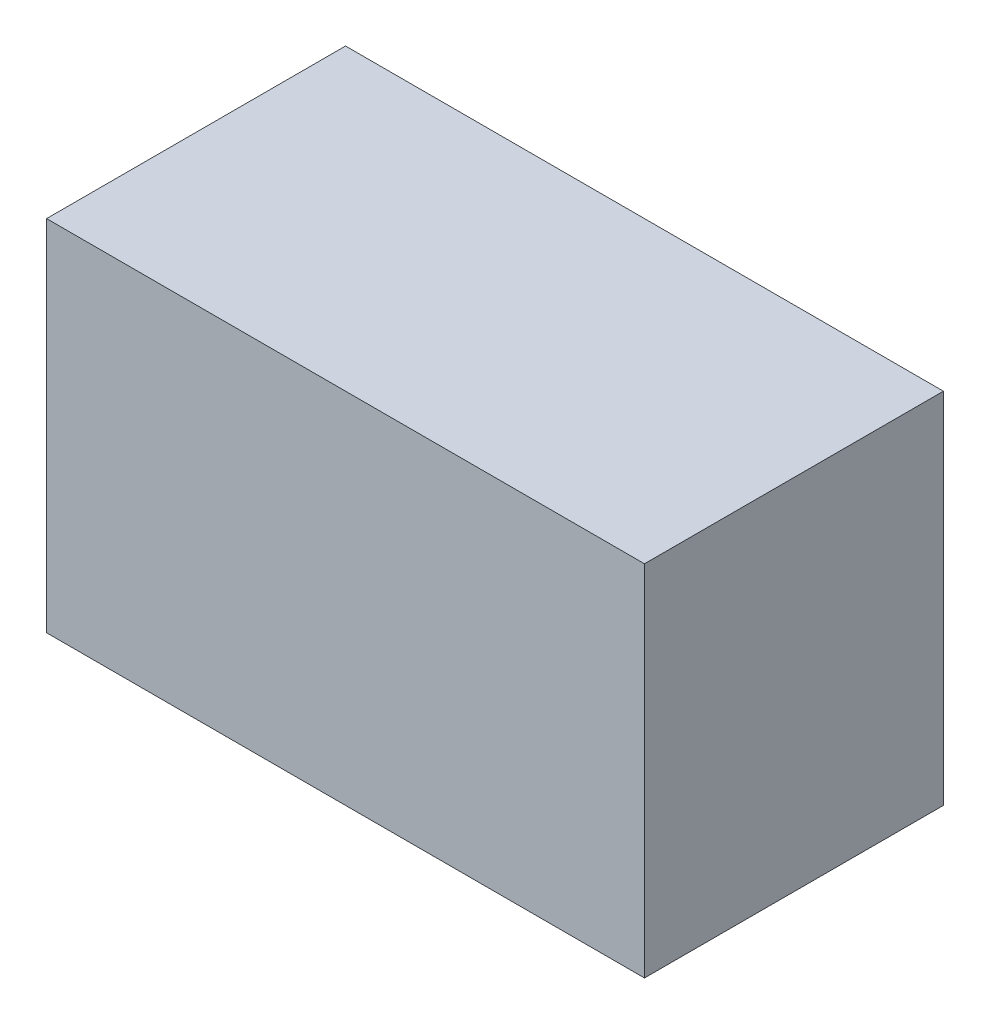
ISO-10303-21;
HEADER;
FILE_DESCRIPTION(('STEP AP214'),'2;1');
FILE_NAME('part.step','',(''),(''),'','','');
FILE_SCHEMA(('AUTOMOTIVE_DESIGN { 1 0 10303 214 1 1 1 1 }'));
ENDSEC;
DATA;
#1=APPLICATION_CONTEXT('core data for automotive mechanical design processes');
#2=APPLICATION_PROTOCOL_DEFINITION('international standard','automotive_design',2000,#1);
#3=PRODUCT_CONTEXT('',#1,'mechanical');
#4=PRODUCT('Part','Part','',(#3));
#5=PRODUCT_RELATED_PRODUCT_CATEGORY('part','',(#4));
#6=PRODUCT_DEFINITION_FORMATION('','',#4);
#7=PRODUCT_DEFINITION_CONTEXT('part definition',#1,'design');
#8=PRODUCT_DEFINITION('design','',#6,#7);
#9=PRODUCT_DEFINITION_SHAPE('','',#8);
#10=(LENGTH_UNIT() NAMED_UNIT(*) SI_UNIT(.MILLI.,.METRE.));
#11=(NAMED_UNIT(*) PLANE_ANGLE_UNIT() SI_UNIT($,.RADIAN.));
#12=(NAMED_UNIT(*) SI_UNIT($,.STERADIAN.) SOLID_ANGLE_UNIT());
#13=UNCERTAINTY_MEASURE_WITH_UNIT(LENGTH_MEASURE(1.E-05),#10,'distance_accuracy_value','');
#14=(GEOMETRIC_REPRESENTATION_CONTEXT(3) GLOBAL_UNCERTAINTY_ASSIGNED_CONTEXT((#13)) GLOBAL_UNIT_ASSIGNED_CONTEXT((#10,
#11,#12)) REPRESENTATION_CONTEXT('',''));
#15=CARTESIAN_POINT('',(0.,0.,0.));
#16=DIRECTION('',(0.,0.,1.));
#17=DIRECTION('',(1.,0.,0.));
#18=AXIS2_PLACEMENT_3D('',#15,#16,#17);
#19=CARTESIAN_POINT('',(0.,0.,127.5));
#20=DIRECTION('',(0.,-1.,0.));
#21=DIRECTION('',(0.,0.,-1.));
#22=AXIS2_PLACEMENT_3D('',#19,#20,#21);
#23=PLANE('',#22);
#24=DIRECTION('',(-1.,0.,0.));
#25=VECTOR('',#24,1.);
#26=CARTESIAN_POINT('',(25.,0.,115.));
#27=LINE('',#26,#25);
#28=CARTESIAN_POINT('',(25.,0.,115.));
#29=VERTEX_POINT('',#28);
#30=CARTESIAN_POINT('',(-25.,0.,115.));
#31=VERTEX_POINT('',#30);
#32=EDGE_CURVE('E27',#29,#31,#27,.T.);
#33=ORIENTED_EDGE('',*,*,#32,.T.);
#34=DIRECTION('',(0.,0.,1.));
#35=VECTOR('',#34,1.);
#36=CARTESIAN_POINT('',(-25.,0.,115.));
#37=LINE('',#36,#35);
#38=CARTESIAN_POINT('',(-25.,0.,140.));
#39=VERTEX_POINT('',#38);
#40=EDGE_CURVE('E100',#31,#39,#37,.T.);
#41=ORIENTED_EDGE('',*,*,#40,.T.);
#42=DIRECTION('',(1.,0.,0.));
#43=VECTOR('',#42,1.);
#44=CARTESIAN_POINT('',(-25.,0.,140.));
#45=LINE('',#44,#43);
#46=CARTESIAN_POINT('',(25.,0.,140.));
#47=VERTEX_POINT('',#46);
#48=EDGE_CURVE('E80',#39,#47,#45,.T.);
#49=ORIENTED_EDGE('',*,*,#48,.T.);
#50=DIRECTION('',(0.,0.,-1.));
#51=VECTOR('',#50,1.);
#52=CARTESIAN_POINT('',(25.,0.,140.));
#53=LINE('',#52,#51);
#54=EDGE_CURVE('E61',#47,#29,#53,.T.);
#55=ORIENTED_EDGE('',*,*,#54,.T.);
#56=EDGE_LOOP('',(#33,#41,#49,#55));
#57=FACE_BOUND('',#56,.T.);
#58=ADVANCED_FACE('F17',(#57),#23,.F.);
#59=CARTESIAN_POINT('',(0.,-30.,127.5));
#60=DIRECTION('',(0.,-1.,0.));
#61=DIRECTION('',(0.,0.,-1.));
#62=AXIS2_PLACEMENT_3D('',#59,#60,#61);
#63=PLANE('',#62);
#64=DIRECTION('',(1.,0.,0.));
#65=VECTOR('',#64,1.);
#66=CARTESIAN_POINT('',(25.,-30.,115.));
#67=LINE('',#66,#65);
#68=CARTESIAN_POINT('',(-25.,-30.,115.));
#69=VERTEX_POINT('',#68);
#70=CARTESIAN_POINT('',(25.,-30.,115.));
#71=VERTEX_POINT('',#70);
#72=EDGE_CURVE('E11',#69,#71,#67,.T.);
#73=ORIENTED_EDGE('',*,*,#72,.T.);
#74=DIRECTION('',(0.,0.,1.));
#75=VECTOR('',#74,1.);
#76=CARTESIAN_POINT('',(25.,-30.,140.));
#77=LINE('',#76,#75);
#78=CARTESIAN_POINT('',(25.,-30.,140.));
#79=VERTEX_POINT('',#78);
#80=EDGE_CURVE('E51',#71,#79,#77,.T.);
#81=ORIENTED_EDGE('',*,*,#80,.T.);
#82=DIRECTION('',(-1.,0.,0.));
#83=VECTOR('',#82,1.);
#84=CARTESIAN_POINT('',(-25.,-30.,140.));
#85=LINE('',#84,#83);
#86=CARTESIAN_POINT('',(-25.,-30.,140.));
#87=VERTEX_POINT('',#86);
#88=EDGE_CURVE('E54',#79,#87,#85,.T.);
#89=ORIENTED_EDGE('',*,*,#88,.T.);
#90=DIRECTION('',(0.,0.,-1.));
#91=VECTOR('',#90,1.);
#92=CARTESIAN_POINT('',(-25.,-30.,115.));
#93=LINE('',#92,#91);
#94=EDGE_CURVE('E110',#87,#69,#93,.T.);
#95=ORIENTED_EDGE('',*,*,#94,.T.);
#96=EDGE_LOOP('',(#73,#81,#89,#95));
#97=FACE_BOUND('',#96,.T.);
#98=ADVANCED_FACE('F52',(#97),#63,.T.);
#99=CARTESIAN_POINT('',(-25.,0.,115.));
#100=DIRECTION('',(0.,0.,-1.));
#101=DIRECTION('',(0.,-1.,0.));
#102=AXIS2_PLACEMENT_3D('',#99,#100,#101);
#103=PLANE('',#102);
#104=ORIENTED_EDGE('',*,*,#32,.F.);
#105=DIRECTION('',(0.,-1.,0.));
#106=VECTOR('',#105,1.);
#107=CARTESIAN_POINT('',(25.,0.,115.));
#108=LINE('',#107,#106);
#109=EDGE_CURVE('E58',#29,#71,#108,.T.);
#110=ORIENTED_EDGE('',*,*,#109,.T.);
#111=ORIENTED_EDGE('',*,*,#72,.F.);
#112=DIRECTION('',(0.,-1.,0.));
#113=VECTOR('',#112,1.);
#114=CARTESIAN_POINT('',(-25.,0.,115.));
#115=LINE('',#114,#113);
#116=EDGE_CURVE('E105',#31,#69,#115,.T.);
#117=ORIENTED_EDGE('',*,*,#116,.F.);
#118=EDGE_LOOP('',(#104,#110,#111,#117));
#119=FACE_BOUND('',#118,.T.);
#120=ADVANCED_FACE('F103',(#119),#103,.T.);
#121=CARTESIAN_POINT('',(25.,0.,115.));
#122=DIRECTION('',(1.,0.,0.));
#123=DIRECTION('',(0.,1.,0.));
#124=AXIS2_PLACEMENT_3D('',#121,#122,#123);
#125=PLANE('',#124);
#126=ORIENTED_EDGE('',*,*,#54,.F.);
#127=DIRECTION('',(0.,-1.,0.));
#128=VECTOR('',#127,1.);
#129=CARTESIAN_POINT('',(25.,0.,140.));
#130=LINE('',#129,#128);
#131=EDGE_CURVE('E63',#47,#79,#130,.T.);
#132=ORIENTED_EDGE('',*,*,#131,.T.);
#133=ORIENTED_EDGE('',*,*,#80,.F.);
#134=ORIENTED_EDGE('',*,*,#109,.F.);
#135=EDGE_LOOP('',(#126,#132,#133,#134));
#136=FACE_BOUND('',#135,.T.);
#137=ADVANCED_FACE('F65',(#136),#125,.T.);
#138=CARTESIAN_POINT('',(25.,0.,140.));
#139=DIRECTION('',(0.,0.,1.));
#140=DIRECTION('',(1.,0.,0.));
#141=AXIS2_PLACEMENT_3D('',#138,#139,#140);
#142=PLANE('',#141);
#143=ORIENTED_EDGE('',*,*,#48,.F.);
#144=DIRECTION('',(0.,-1.,0.));
#145=VECTOR('',#144,1.);
#146=CARTESIAN_POINT('',(-25.,0.,140.));
#147=LINE('',#146,#145);
#148=EDGE_CURVE('E72',#39,#87,#147,.T.);
#149=ORIENTED_EDGE('',*,*,#148,.T.);
#150=ORIENTED_EDGE('',*,*,#88,.F.);
#151=ORIENTED_EDGE('',*,*,#131,.F.);
#152=EDGE_LOOP('',(#143,#149,#150,#151));
#153=FACE_BOUND('',#152,.T.);
#154=ADVANCED_FACE('F71',(#153),#142,.T.);
#155=CARTESIAN_POINT('',(-25.,0.,140.));
#156=DIRECTION('',(-1.,0.,0.));
#157=DIRECTION('',(0.,0.,1.));
#158=AXIS2_PLACEMENT_3D('',#155,#156,#157);
#159=PLANE('',#158);
#160=ORIENTED_EDGE('',*,*,#40,.F.);
#161=ORIENTED_EDGE('',*,*,#116,.T.);
#162=ORIENTED_EDGE('',*,*,#94,.F.);
#163=ORIENTED_EDGE('',*,*,#148,.F.);
#164=EDGE_LOOP('',(#160,#161,#162,#163));
#165=FACE_BOUND('',#164,.T.);
#166=ADVANCED_FACE('F108',(#165),#159,.T.);
#167=CLOSED_SHELL('',(#58,#98,#120,#137,#154,#166));
#168=MANIFOLD_SOLID_BREP('B1',#167);
#169=ADVANCED_BREP_SHAPE_REPRESENTATION('',(#18,#168),#14);
#170=SHAPE_DEFINITION_REPRESENTATION(#9,#169);
ENDSEC;
END-ISO-10303-21;
